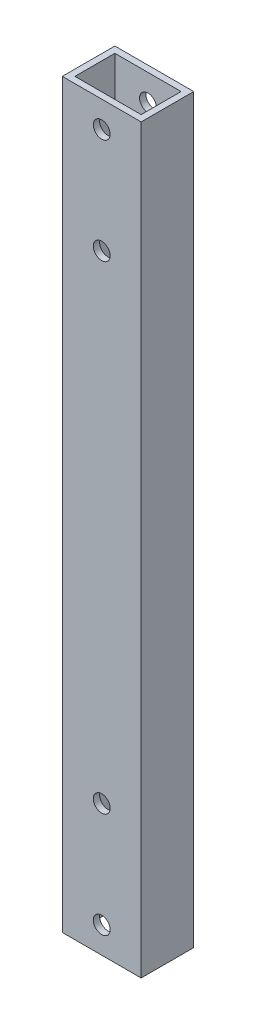
ISO-10303-21;
HEADER;
FILE_DESCRIPTION(('STEP AP214'),'2;1');
FILE_NAME('part.step','',(''),(''),'','','');
FILE_SCHEMA(('AUTOMOTIVE_DESIGN { 1 0 10303 214 1 1 1 1 }'));
ENDSEC;
DATA;
#1=APPLICATION_CONTEXT('core data for automotive mechanical design processes');
#2=APPLICATION_PROTOCOL_DEFINITION('international standard','automotive_design',2000,#1);
#3=PRODUCT_CONTEXT('',#1,'mechanical');
#4=PRODUCT('Part','Part','',(#3));
#5=PRODUCT_RELATED_PRODUCT_CATEGORY('part','',(#4));
#6=PRODUCT_DEFINITION_FORMATION('','',#4);
#7=PRODUCT_DEFINITION_CONTEXT('part definition',#1,'design');
#8=PRODUCT_DEFINITION('design','',#6,#7);
#9=PRODUCT_DEFINITION_SHAPE('','',#8);
#10=(LENGTH_UNIT() NAMED_UNIT(*) SI_UNIT(.MILLI.,.METRE.));
#11=(NAMED_UNIT(*) PLANE_ANGLE_UNIT() SI_UNIT($,.RADIAN.));
#12=(NAMED_UNIT(*) SI_UNIT($,.STERADIAN.) SOLID_ANGLE_UNIT());
#13=UNCERTAINTY_MEASURE_WITH_UNIT(LENGTH_MEASURE(1.E-05),#10,'distance_accuracy_value','');
#14=(GEOMETRIC_REPRESENTATION_CONTEXT(3) GLOBAL_UNCERTAINTY_ASSIGNED_CONTEXT((#13)) GLOBAL_UNIT_ASSIGNED_CONTEXT((#10,
#11,#12)) REPRESENTATION_CONTEXT('',''));
#15=CARTESIAN_POINT('',(0.,0.,0.));
#16=DIRECTION('',(0.,0.,1.));
#17=DIRECTION('',(1.,0.,0.));
#18=AXIS2_PLACEMENT_3D('',#15,#16,#17);
#19=CARTESIAN_POINT('',(0.,70.5,0.));
#20=DIRECTION('',(0.,1.,0.));
#21=DIRECTION('',(0.,0.,1.));
#22=AXIS2_PLACEMENT_3D('',#19,#20,#21);
#23=PLANE('',#22);
#24=DIRECTION('',(0.,0.,-1.));
#25=VECTOR('',#24,1.);
#26=CARTESIAN_POINT('',(7.5,70.5,-5.));
#27=LINE('',#26,#25);
#28=CARTESIAN_POINT('',(7.5,70.5,5.));
#29=VERTEX_POINT('',#28);
#30=CARTESIAN_POINT('',(7.5,70.5,-5.));
#31=VERTEX_POINT('',#30);
#32=EDGE_CURVE('E137',#29,#31,#27,.T.);
#33=ORIENTED_EDGE('',*,*,#32,.T.);
#34=DIRECTION('',(-1.,0.,0.));
#35=VECTOR('',#34,1.);
#36=CARTESIAN_POINT('',(-7.5,70.5,-5.));
#37=LINE('',#36,#35);
#38=CARTESIAN_POINT('',(-7.5,70.5,-5.));
#39=VERTEX_POINT('',#38);
#40=EDGE_CURVE('E140',#31,#39,#37,.T.);
#41=ORIENTED_EDGE('',*,*,#40,.T.);
#42=DIRECTION('',(0.,0.,1.));
#43=VECTOR('',#42,1.);
#44=CARTESIAN_POINT('',(-7.5,70.5,-5.));
#45=LINE('',#44,#43);
#46=CARTESIAN_POINT('',(-7.5,70.5,5.));
#47=VERTEX_POINT('',#46);
#48=EDGE_CURVE('E143',#39,#47,#45,.T.);
#49=ORIENTED_EDGE('',*,*,#48,.T.);
#50=DIRECTION('',(1.,0.,0.));
#51=VECTOR('',#50,1.);
#52=CARTESIAN_POINT('',(-7.5,70.5,5.));
#53=LINE('',#52,#51);
#54=EDGE_CURVE('E145',#47,#29,#53,.T.);
#55=ORIENTED_EDGE('',*,*,#54,.T.);
#56=EDGE_LOOP('',(#33,#41,#49,#55));
#57=FACE_BOUND('',#56,.T.);
#58=DIRECTION('',(1.,0.,0.));
#59=VECTOR('',#58,1.);
#60=CARTESIAN_POINT('',(-6.3,70.5,3.8));
#61=LINE('',#60,#59);
#62=CARTESIAN_POINT('',(-6.3,70.5,3.8));
#63=VERTEX_POINT('',#62);
#64=CARTESIAN_POINT('',(6.3,70.5,3.8));
#65=VERTEX_POINT('',#64);
#66=EDGE_CURVE('E107',#63,#65,#61,.T.);
#67=ORIENTED_EDGE('',*,*,#66,.F.);
#68=DIRECTION('',(0.,0.,1.));
#69=VECTOR('',#68,1.);
#70=CARTESIAN_POINT('',(-6.3,70.5,-3.8));
#71=LINE('',#70,#69);
#72=CARTESIAN_POINT('',(-6.3,70.5,-3.8));
#73=VERTEX_POINT('',#72);
#74=EDGE_CURVE('E99',#73,#63,#71,.T.);
#75=ORIENTED_EDGE('',*,*,#74,.F.);
#76=DIRECTION('',(-1.,0.,0.));
#77=VECTOR('',#76,1.);
#78=CARTESIAN_POINT('',(-6.3,70.5,-3.8));
#79=LINE('',#78,#77);
#80=CARTESIAN_POINT('',(6.3,70.5,-3.8));
#81=VERTEX_POINT('',#80);
#82=EDGE_CURVE('E121',#81,#73,#79,.T.);
#83=ORIENTED_EDGE('',*,*,#82,.F.);
#84=DIRECTION('',(0.,0.,-1.));
#85=VECTOR('',#84,1.);
#86=CARTESIAN_POINT('',(6.3,70.5,-3.8));
#87=LINE('',#86,#85);
#88=EDGE_CURVE('E119',#65,#81,#87,.T.);
#89=ORIENTED_EDGE('',*,*,#88,.F.);
#90=EDGE_LOOP('',(#67,#75,#83,#89));
#91=FACE_BOUND('',#90,.T.);
#92=ADVANCED_FACE('F32',(#57,#91),#23,.T.);
#93=CARTESIAN_POINT('',(0.,-70.5,0.));
#94=DIRECTION('',(0.,1.,0.));
#95=DIRECTION('',(0.,0.,1.));
#96=AXIS2_PLACEMENT_3D('',#93,#94,#95);
#97=PLANE('',#96);
#98=DIRECTION('',(0.,0.,-1.));
#99=VECTOR('',#98,1.);
#100=CARTESIAN_POINT('',(7.5,-70.5,-5.));
#101=LINE('',#100,#99);
#102=CARTESIAN_POINT('',(7.5,-70.5,5.));
#103=VERTEX_POINT('',#102);
#104=CARTESIAN_POINT('',(7.5,-70.5,-5.));
#105=VERTEX_POINT('',#104);
#106=EDGE_CURVE('E115',#103,#105,#101,.T.);
#107=ORIENTED_EDGE('',*,*,#106,.F.);
#108=DIRECTION('',(1.,0.,0.));
#109=VECTOR('',#108,1.);
#110=CARTESIAN_POINT('',(-7.5,-70.5,5.));
#111=LINE('',#110,#109);
#112=CARTESIAN_POINT('',(-7.5,-70.5,5.));
#113=VERTEX_POINT('',#112);
#114=EDGE_CURVE('E141',#113,#103,#111,.T.);
#115=ORIENTED_EDGE('',*,*,#114,.F.);
#116=DIRECTION('',(0.,0.,1.));
#117=VECTOR('',#116,1.);
#118=CARTESIAN_POINT('',(-7.5,-70.5,-5.));
#119=LINE('',#118,#117);
#120=CARTESIAN_POINT('',(-7.5,-70.5,-5.));
#121=VERTEX_POINT('',#120);
#122=EDGE_CURVE('E152',#121,#113,#119,.T.);
#123=ORIENTED_EDGE('',*,*,#122,.F.);
#124=DIRECTION('',(-1.,0.,0.));
#125=VECTOR('',#124,1.);
#126=CARTESIAN_POINT('',(-7.5,-70.5,-5.));
#127=LINE('',#126,#125);
#128=EDGE_CURVE('E150',#105,#121,#127,.T.);
#129=ORIENTED_EDGE('',*,*,#128,.F.);
#130=EDGE_LOOP('',(#107,#115,#123,#129));
#131=FACE_BOUND('',#130,.T.);
#132=DIRECTION('',(0.,0.,1.));
#133=VECTOR('',#132,1.);
#134=CARTESIAN_POINT('',(-6.3,-70.5,-3.8));
#135=LINE('',#134,#133);
#136=CARTESIAN_POINT('',(-6.3,-70.5,-3.8));
#137=VERTEX_POINT('',#136);
#138=CARTESIAN_POINT('',(-6.3,-70.5,3.8));
#139=VERTEX_POINT('',#138);
#140=EDGE_CURVE('E57',#137,#139,#135,.T.);
#141=ORIENTED_EDGE('',*,*,#140,.T.);
#142=DIRECTION('',(1.,0.,0.));
#143=VECTOR('',#142,1.);
#144=CARTESIAN_POINT('',(-6.3,-70.5,3.8));
#145=LINE('',#144,#143);
#146=CARTESIAN_POINT('',(6.3,-70.5,3.8));
#147=VERTEX_POINT('',#146);
#148=EDGE_CURVE('E114',#139,#147,#145,.T.);
#149=ORIENTED_EDGE('',*,*,#148,.T.);
#150=DIRECTION('',(0.,0.,-1.));
#151=VECTOR('',#150,1.);
#152=CARTESIAN_POINT('',(6.3,-70.5,-3.8));
#153=LINE('',#152,#151);
#154=CARTESIAN_POINT('',(6.3,-70.5,-3.8));
#155=VERTEX_POINT('',#154);
#156=EDGE_CURVE('E129',#147,#155,#153,.T.);
#157=ORIENTED_EDGE('',*,*,#156,.T.);
#158=DIRECTION('',(-1.,0.,0.));
#159=VECTOR('',#158,1.);
#160=CARTESIAN_POINT('',(-6.3,-70.5,-3.8));
#161=LINE('',#160,#159);
#162=EDGE_CURVE('E108',#155,#137,#161,.T.);
#163=ORIENTED_EDGE('',*,*,#162,.T.);
#164=EDGE_LOOP('',(#141,#149,#157,#163));
#165=FACE_BOUND('',#164,.T.);
#166=ADVANCED_FACE('F215',(#131,#165),#97,.F.);
#167=CARTESIAN_POINT('',(7.5,70.5,-5.));
#168=DIRECTION('',(-1.,0.,0.));
#169=DIRECTION('',(0.,0.,1.));
#170=AXIS2_PLACEMENT_3D('',#167,#168,#169);
#171=PLANE('',#170);
#172=ORIENTED_EDGE('',*,*,#106,.T.);
#173=DIRECTION('',(0.,-1.,0.));
#174=VECTOR('',#173,1.);
#175=CARTESIAN_POINT('',(7.5,70.5,-5.));
#176=LINE('',#175,#174);
#177=EDGE_CURVE('E11',#31,#105,#176,.T.);
#178=ORIENTED_EDGE('',*,*,#177,.F.);
#179=ORIENTED_EDGE('',*,*,#32,.F.);
#180=DIRECTION('',(0.,-1.,0.));
#181=VECTOR('',#180,1.);
#182=CARTESIAN_POINT('',(7.5,70.5,5.));
#183=LINE('',#182,#181);
#184=EDGE_CURVE('E147',#29,#103,#183,.T.);
#185=ORIENTED_EDGE('',*,*,#184,.T.);
#186=EDGE_LOOP('',(#172,#178,#179,#185));
#187=FACE_BOUND('',#186,.T.);
#188=ADVANCED_FACE('F34',(#187),#171,.F.);
#189=CARTESIAN_POINT('',(-7.5,70.5,-5.));
#190=DIRECTION('',(0.,0.,1.));
#191=DIRECTION('',(1.,0.,0.));
#192=AXIS2_PLACEMENT_3D('',#189,#190,#191);
#193=PLANE('',#192);
#194=CARTESIAN_POINT('',(0.,-65.5,-5.));
#195=DIRECTION('',(0.,0.,-1.));
#196=DIRECTION('',(-1.,0.,0.));
#197=AXIS2_PLACEMENT_3D('',#194,#195,#196);
#198=CIRCLE('',#197,1.60000000000001);
#199=CARTESIAN_POINT('',(-1.60000000000001,-65.5,-5.));
#200=VERTEX_POINT('',#199);
#201=EDGE_CURVE('E166',#200,#200,#198,.T.);
#202=ORIENTED_EDGE('',*,*,#201,.F.);
#203=EDGE_LOOP('',(#202));
#204=FACE_BOUND('',#203,.T.);
#205=CARTESIAN_POINT('',(0.,-45.5,-5.));
#206=DIRECTION('',(0.,0.,-1.));
#207=DIRECTION('',(-1.,0.,0.));
#208=AXIS2_PLACEMENT_3D('',#205,#206,#207);
#209=CIRCLE('',#208,1.6);
#210=CARTESIAN_POINT('',(-1.6,-45.5,-5.));
#211=VERTEX_POINT('',#210);
#212=EDGE_CURVE('E244',#211,#211,#209,.T.);
#213=ORIENTED_EDGE('',*,*,#212,.F.);
#214=EDGE_LOOP('',(#213));
#215=FACE_BOUND('',#214,.T.);
#216=CARTESIAN_POINT('',(0.,45.5,-5.));
#217=DIRECTION('',(0.,0.,-1.));
#218=DIRECTION('',(1.,0.,0.));
#219=AXIS2_PLACEMENT_3D('',#216,#217,#218);
#220=CIRCLE('',#219,1.6);
#221=CARTESIAN_POINT('',(1.59999999999999,45.5,-5.));
#222=VERTEX_POINT('',#221);
#223=EDGE_CURVE('E248',#222,#222,#220,.T.);
#224=ORIENTED_EDGE('',*,*,#223,.F.);
#225=EDGE_LOOP('',(#224));
#226=FACE_BOUND('',#225,.T.);
#227=CARTESIAN_POINT('',(0.,65.5,-5.));
#228=DIRECTION('',(0.,0.,-1.));
#229=DIRECTION('',(1.,0.,0.));
#230=AXIS2_PLACEMENT_3D('',#227,#228,#229);
#231=CIRCLE('',#230,1.60000000000001);
#232=CARTESIAN_POINT('',(1.6,65.5,-5.));
#233=VERTEX_POINT('',#232);
#234=EDGE_CURVE('E252',#233,#233,#231,.T.);
#235=ORIENTED_EDGE('',*,*,#234,.F.);
#236=EDGE_LOOP('',(#235));
#237=FACE_BOUND('',#236,.T.);
#238=ORIENTED_EDGE('',*,*,#128,.T.);
#239=DIRECTION('',(0.,-1.,0.));
#240=VECTOR('',#239,1.);
#241=CARTESIAN_POINT('',(-7.5,70.5,-5.));
#242=LINE('',#241,#240);
#243=EDGE_CURVE('E41',#39,#121,#242,.T.);
#244=ORIENTED_EDGE('',*,*,#243,.F.);
#245=ORIENTED_EDGE('',*,*,#40,.F.);
#246=ORIENTED_EDGE('',*,*,#177,.T.);
#247=EDGE_LOOP('',(#238,#244,#245,#246));
#248=FACE_BOUND('',#247,.T.);
#249=ADVANCED_FACE('F230',(#204,#215,#226,#237,#248),#193,.F.);
#250=CARTESIAN_POINT('',(-7.5,70.5,-5.));
#251=DIRECTION('',(1.,0.,0.));
#252=DIRECTION('',(0.,0.,-1.));
#253=AXIS2_PLACEMENT_3D('',#250,#251,#252);
#254=PLANE('',#253);
#255=ORIENTED_EDGE('',*,*,#122,.T.);
#256=DIRECTION('',(0.,-1.,0.));
#257=VECTOR('',#256,1.);
#258=CARTESIAN_POINT('',(-7.5,70.5,5.));
#259=LINE('',#258,#257);
#260=EDGE_CURVE('E157',#47,#113,#259,.T.);
#261=ORIENTED_EDGE('',*,*,#260,.F.);
#262=ORIENTED_EDGE('',*,*,#48,.F.);
#263=ORIENTED_EDGE('',*,*,#243,.T.);
#264=EDGE_LOOP('',(#255,#261,#262,#263));
#265=FACE_BOUND('',#264,.T.);
#266=ADVANCED_FACE('F228',(#265),#254,.F.);
#267=CARTESIAN_POINT('',(-7.5,70.5,5.));
#268=DIRECTION('',(0.,0.,-1.));
#269=DIRECTION('',(-1.,0.,0.));
#270=AXIS2_PLACEMENT_3D('',#267,#268,#269);
#271=PLANE('',#270);
#272=CARTESIAN_POINT('',(0.,-65.5,5.));
#273=DIRECTION('',(0.,0.,-1.));
#274=DIRECTION('',(-1.,0.,0.));
#275=AXIS2_PLACEMENT_3D('',#272,#273,#274);
#276=CIRCLE('',#275,1.60000000000001);
#277=CARTESIAN_POINT('',(-1.60000000000001,-65.5,5.));
#278=VERTEX_POINT('',#277);
#279=EDGE_CURVE('E127',#278,#278,#276,.T.);
#280=ORIENTED_EDGE('',*,*,#279,.T.);
#281=EDGE_LOOP('',(#280));
#282=FACE_BOUND('',#281,.T.);
#283=CARTESIAN_POINT('',(0.,-45.5,5.));
#284=DIRECTION('',(0.,0.,-1.));
#285=DIRECTION('',(-1.,0.,0.));
#286=AXIS2_PLACEMENT_3D('',#283,#284,#285);
#287=CIRCLE('',#286,1.6);
#288=CARTESIAN_POINT('',(-1.6,-45.5,5.));
#289=VERTEX_POINT('',#288);
#290=EDGE_CURVE('E178',#289,#289,#287,.T.);
#291=ORIENTED_EDGE('',*,*,#290,.T.);
#292=EDGE_LOOP('',(#291));
#293=FACE_BOUND('',#292,.T.);
#294=CARTESIAN_POINT('',(0.,45.5,5.));
#295=DIRECTION('',(0.,0.,-1.));
#296=DIRECTION('',(-1.,0.,0.));
#297=AXIS2_PLACEMENT_3D('',#294,#295,#296);
#298=CIRCLE('',#297,1.6);
#299=CARTESIAN_POINT('',(-1.6,45.5,5.));
#300=VERTEX_POINT('',#299);
#301=EDGE_CURVE('E174',#300,#300,#298,.T.);
#302=ORIENTED_EDGE('',*,*,#301,.T.);
#303=EDGE_LOOP('',(#302));
#304=FACE_BOUND('',#303,.T.);
#305=CARTESIAN_POINT('',(0.,65.5,5.));
#306=DIRECTION('',(0.,0.,-1.));
#307=DIRECTION('',(-1.,0.,0.));
#308=AXIS2_PLACEMENT_3D('',#305,#306,#307);
#309=CIRCLE('',#308,1.60000000000001);
#310=CARTESIAN_POINT('',(-1.60000000000001,65.5,5.));
#311=VERTEX_POINT('',#310);
#312=EDGE_CURVE('E170',#311,#311,#309,.T.);
#313=ORIENTED_EDGE('',*,*,#312,.T.);
#314=EDGE_LOOP('',(#313));
#315=FACE_BOUND('',#314,.T.);
#316=ORIENTED_EDGE('',*,*,#114,.T.);
#317=ORIENTED_EDGE('',*,*,#184,.F.);
#318=ORIENTED_EDGE('',*,*,#54,.F.);
#319=ORIENTED_EDGE('',*,*,#260,.T.);
#320=EDGE_LOOP('',(#316,#317,#318,#319));
#321=FACE_BOUND('',#320,.T.);
#322=ADVANCED_FACE('F195',(#282,#293,#304,#315,#321),#271,.F.);
#323=CARTESIAN_POINT('',(-6.3,70.5,-3.8));
#324=DIRECTION('',(1.,0.,0.));
#325=DIRECTION('',(0.,0.,-1.));
#326=AXIS2_PLACEMENT_3D('',#323,#324,#325);
#327=PLANE('',#326);
#328=ORIENTED_EDGE('',*,*,#140,.F.);
#329=DIRECTION('',(0.,-1.,0.));
#330=VECTOR('',#329,1.);
#331=CARTESIAN_POINT('',(-6.3,70.5,-3.8));
#332=LINE('',#331,#330);
#333=EDGE_CURVE('E103',#73,#137,#332,.T.);
#334=ORIENTED_EDGE('',*,*,#333,.F.);
#335=ORIENTED_EDGE('',*,*,#74,.T.);
#336=DIRECTION('',(0.,-1.,0.));
#337=VECTOR('',#336,1.);
#338=CARTESIAN_POINT('',(-6.3,70.5,3.8));
#339=LINE('',#338,#337);
#340=EDGE_CURVE('E102',#63,#139,#339,.T.);
#341=ORIENTED_EDGE('',*,*,#340,.T.);
#342=EDGE_LOOP('',(#328,#334,#335,#341));
#343=FACE_BOUND('',#342,.T.);
#344=ADVANCED_FACE('F101',(#343),#327,.T.);
#345=CARTESIAN_POINT('',(-6.3,70.5,3.8));
#346=DIRECTION('',(0.,0.,-1.));
#347=DIRECTION('',(-1.,0.,0.));
#348=AXIS2_PLACEMENT_3D('',#345,#346,#347);
#349=PLANE('',#348);
#350=CARTESIAN_POINT('',(0.,-65.5,3.8));
#351=DIRECTION('',(0.,0.,-1.));
#352=DIRECTION('',(-1.,0.,0.));
#353=AXIS2_PLACEMENT_3D('',#350,#351,#352);
#354=CIRCLE('',#353,1.60000000000001);
#355=CARTESIAN_POINT('',(-1.60000000000001,-65.5,3.8));
#356=VERTEX_POINT('',#355);
#357=EDGE_CURVE('E190',#356,#356,#354,.T.);
#358=ORIENTED_EDGE('',*,*,#357,.F.);
#359=EDGE_LOOP('',(#358));
#360=FACE_BOUND('',#359,.T.);
#361=CARTESIAN_POINT('',(0.,-45.5,3.8));
#362=DIRECTION('',(0.,0.,-1.));
#363=DIRECTION('',(-1.,0.,0.));
#364=AXIS2_PLACEMENT_3D('',#361,#362,#363);
#365=CIRCLE('',#364,1.6);
#366=CARTESIAN_POINT('',(-1.6,-45.5,3.8));
#367=VERTEX_POINT('',#366);
#368=EDGE_CURVE('E173',#367,#367,#365,.T.);
#369=ORIENTED_EDGE('',*,*,#368,.F.);
#370=EDGE_LOOP('',(#369));
#371=FACE_BOUND('',#370,.T.);
#372=CARTESIAN_POINT('',(0.,45.5,3.8));
#373=DIRECTION('',(0.,0.,-1.));
#374=DIRECTION('',(-1.,0.,0.));
#375=AXIS2_PLACEMENT_3D('',#372,#373,#374);
#376=CIRCLE('',#375,1.6);
#377=CARTESIAN_POINT('',(-1.6,45.5,3.8));
#378=VERTEX_POINT('',#377);
#379=EDGE_CURVE('E169',#378,#378,#376,.T.);
#380=ORIENTED_EDGE('',*,*,#379,.F.);
#381=EDGE_LOOP('',(#380));
#382=FACE_BOUND('',#381,.T.);
#383=CARTESIAN_POINT('',(0.,65.5,3.8));
#384=DIRECTION('',(0.,0.,-1.));
#385=DIRECTION('',(-1.,0.,0.));
#386=AXIS2_PLACEMENT_3D('',#383,#384,#385);
#387=CIRCLE('',#386,1.60000000000001);
#388=CARTESIAN_POINT('',(-1.60000000000001,65.5,3.8));
#389=VERTEX_POINT('',#388);
#390=EDGE_CURVE('E165',#389,#389,#387,.T.);
#391=ORIENTED_EDGE('',*,*,#390,.F.);
#392=EDGE_LOOP('',(#391));
#393=FACE_BOUND('',#392,.T.);
#394=ORIENTED_EDGE('',*,*,#148,.F.);
#395=ORIENTED_EDGE('',*,*,#340,.F.);
#396=ORIENTED_EDGE('',*,*,#66,.T.);
#397=DIRECTION('',(0.,-1.,0.));
#398=VECTOR('',#397,1.);
#399=CARTESIAN_POINT('',(6.3,70.5,3.8));
#400=LINE('',#399,#398);
#401=EDGE_CURVE('E116',#65,#147,#400,.T.);
#402=ORIENTED_EDGE('',*,*,#401,.T.);
#403=EDGE_LOOP('',(#394,#395,#396,#402));
#404=FACE_BOUND('',#403,.T.);
#405=ADVANCED_FACE('F111',(#360,#371,#382,#393,#404),#349,.T.);
#406=CARTESIAN_POINT('',(6.3,70.5,-3.8));
#407=DIRECTION('',(-1.,0.,0.));
#408=DIRECTION('',(0.,0.,1.));
#409=AXIS2_PLACEMENT_3D('',#406,#407,#408);
#410=PLANE('',#409);
#411=ORIENTED_EDGE('',*,*,#156,.F.);
#412=ORIENTED_EDGE('',*,*,#401,.F.);
#413=ORIENTED_EDGE('',*,*,#88,.T.);
#414=DIRECTION('',(0.,-1.,0.));
#415=VECTOR('',#414,1.);
#416=CARTESIAN_POINT('',(6.3,70.5,-3.8));
#417=LINE('',#416,#415);
#418=EDGE_CURVE('E49',#81,#155,#417,.T.);
#419=ORIENTED_EDGE('',*,*,#418,.T.);
#420=EDGE_LOOP('',(#411,#412,#413,#419));
#421=FACE_BOUND('',#420,.T.);
#422=ADVANCED_FACE('F269',(#421),#410,.T.);
#423=CARTESIAN_POINT('',(-6.3,70.5,-3.8));
#424=DIRECTION('',(0.,0.,1.));
#425=DIRECTION('',(1.,0.,0.));
#426=AXIS2_PLACEMENT_3D('',#423,#424,#425);
#427=PLANE('',#426);
#428=CARTESIAN_POINT('',(0.,-65.5,-3.8));
#429=DIRECTION('',(0.,0.,1.));
#430=DIRECTION('',(1.,0.,0.));
#431=AXIS2_PLACEMENT_3D('',#428,#429,#430);
#432=CIRCLE('',#431,1.60000000000001);
#433=CARTESIAN_POINT('',(1.6,-65.5,-3.8));
#434=VERTEX_POINT('',#433);
#435=EDGE_CURVE('E36',#434,#434,#432,.T.);
#436=ORIENTED_EDGE('',*,*,#435,.F.);
#437=EDGE_LOOP('',(#436));
#438=FACE_BOUND('',#437,.T.);
#439=CARTESIAN_POINT('',(0.,-45.5,-3.8));
#440=DIRECTION('',(0.,0.,1.));
#441=DIRECTION('',(1.,0.,0.));
#442=AXIS2_PLACEMENT_3D('',#439,#440,#441);
#443=CIRCLE('',#442,1.6);
#444=CARTESIAN_POINT('',(1.59999999999999,-45.5,-3.8));
#445=VERTEX_POINT('',#444);
#446=EDGE_CURVE('E171',#445,#445,#443,.T.);
#447=ORIENTED_EDGE('',*,*,#446,.F.);
#448=EDGE_LOOP('',(#447));
#449=FACE_BOUND('',#448,.T.);
#450=CARTESIAN_POINT('',(0.,45.5,-3.8));
#451=DIRECTION('',(0.,0.,1.));
#452=DIRECTION('',(1.,0.,0.));
#453=AXIS2_PLACEMENT_3D('',#450,#451,#452);
#454=CIRCLE('',#453,1.6);
#455=CARTESIAN_POINT('',(1.59999999999999,45.5,-3.8));
#456=VERTEX_POINT('',#455);
#457=EDGE_CURVE('E167',#456,#456,#454,.T.);
#458=ORIENTED_EDGE('',*,*,#457,.F.);
#459=EDGE_LOOP('',(#458));
#460=FACE_BOUND('',#459,.T.);
#461=CARTESIAN_POINT('',(0.,65.5,-3.8));
#462=DIRECTION('',(0.,0.,1.));
#463=DIRECTION('',(1.,0.,0.));
#464=AXIS2_PLACEMENT_3D('',#461,#462,#463);
#465=CIRCLE('',#464,1.60000000000001);
#466=CARTESIAN_POINT('',(1.6,65.5,-3.8));
#467=VERTEX_POINT('',#466);
#468=EDGE_CURVE('E162',#467,#467,#465,.T.);
#469=ORIENTED_EDGE('',*,*,#468,.F.);
#470=EDGE_LOOP('',(#469));
#471=FACE_BOUND('',#470,.T.);
#472=ORIENTED_EDGE('',*,*,#162,.F.);
#473=ORIENTED_EDGE('',*,*,#418,.F.);
#474=ORIENTED_EDGE('',*,*,#82,.T.);
#475=ORIENTED_EDGE('',*,*,#333,.T.);
#476=EDGE_LOOP('',(#472,#473,#474,#475));
#477=FACE_BOUND('',#476,.T.);
#478=ADVANCED_FACE('F266',(#438,#449,#460,#471,#477),#427,.T.);
#479=CARTESIAN_POINT('',(0.,65.5,95.));
#480=DIRECTION('',(0.,0.,-1.));
#481=DIRECTION('',(-1.,0.,0.));
#482=AXIS2_PLACEMENT_3D('',#479,#480,#481);
#483=CYLINDRICAL_SURFACE('',#482,1.60000000000001);
#484=ORIENTED_EDGE('',*,*,#468,.T.);
#485=EDGE_LOOP('',(#484));
#486=FACE_BOUND('',#485,.T.);
#487=ORIENTED_EDGE('',*,*,#234,.T.);
#488=EDGE_LOOP('',(#487));
#489=FACE_BOUND('',#488,.T.);
#490=ADVANCED_FACE('F268',(#486,#489),#483,.F.);
#491=CARTESIAN_POINT('',(0.,45.5,95.));
#492=DIRECTION('',(0.,0.,-1.));
#493=DIRECTION('',(-1.,0.,0.));
#494=AXIS2_PLACEMENT_3D('',#491,#492,#493);
#495=CYLINDRICAL_SURFACE('',#494,1.6);
#496=ORIENTED_EDGE('',*,*,#457,.T.);
#497=EDGE_LOOP('',(#496));
#498=FACE_BOUND('',#497,.T.);
#499=ORIENTED_EDGE('',*,*,#223,.T.);
#500=EDGE_LOOP('',(#499));
#501=FACE_BOUND('',#500,.T.);
#502=ADVANCED_FACE('F276',(#498,#501),#495,.F.);
#503=CARTESIAN_POINT('',(0.,-45.5,95.));
#504=DIRECTION('',(0.,0.,-1.));
#505=DIRECTION('',(-1.,0.,0.));
#506=AXIS2_PLACEMENT_3D('',#503,#504,#505);
#507=CYLINDRICAL_SURFACE('',#506,1.6);
#508=ORIENTED_EDGE('',*,*,#446,.T.);
#509=EDGE_LOOP('',(#508));
#510=FACE_BOUND('',#509,.T.);
#511=ORIENTED_EDGE('',*,*,#212,.T.);
#512=EDGE_LOOP('',(#511));
#513=FACE_BOUND('',#512,.T.);
#514=ADVANCED_FACE('F210',(#510,#513),#507,.F.);
#515=CARTESIAN_POINT('',(0.,-65.5,95.));
#516=DIRECTION('',(0.,0.,-1.));
#517=DIRECTION('',(-1.,0.,0.));
#518=AXIS2_PLACEMENT_3D('',#515,#516,#517);
#519=CYLINDRICAL_SURFACE('',#518,1.60000000000001);
#520=ORIENTED_EDGE('',*,*,#435,.T.);
#521=EDGE_LOOP('',(#520));
#522=FACE_BOUND('',#521,.T.);
#523=ORIENTED_EDGE('',*,*,#201,.T.);
#524=EDGE_LOOP('',(#523));
#525=FACE_BOUND('',#524,.T.);
#526=ADVANCED_FACE('F203',(#522,#525),#519,.F.);
#527=ORIENTED_EDGE('',*,*,#390,.T.);
#528=EDGE_LOOP('',(#527));
#529=FACE_BOUND('',#528,.T.);
#530=ORIENTED_EDGE('',*,*,#312,.F.);
#531=EDGE_LOOP('',(#530));
#532=FACE_BOUND('',#531,.T.);
#533=ADVANCED_FACE('F212',(#529,#532),#483,.F.);
#534=ORIENTED_EDGE('',*,*,#379,.T.);
#535=EDGE_LOOP('',(#534));
#536=FACE_BOUND('',#535,.T.);
#537=ORIENTED_EDGE('',*,*,#301,.F.);
#538=EDGE_LOOP('',(#537));
#539=FACE_BOUND('',#538,.T.);
#540=ADVANCED_FACE('F207',(#536,#539),#495,.F.);
#541=ORIENTED_EDGE('',*,*,#368,.T.);
#542=EDGE_LOOP('',(#541));
#543=FACE_BOUND('',#542,.T.);
#544=ORIENTED_EDGE('',*,*,#290,.F.);
#545=EDGE_LOOP('',(#544));
#546=FACE_BOUND('',#545,.T.);
#547=ADVANCED_FACE('F200',(#543,#546),#507,.F.);
#548=ORIENTED_EDGE('',*,*,#357,.T.);
#549=EDGE_LOOP('',(#548));
#550=FACE_BOUND('',#549,.T.);
#551=ORIENTED_EDGE('',*,*,#279,.F.);
#552=EDGE_LOOP('',(#551));
#553=FACE_BOUND('',#552,.T.);
#554=ADVANCED_FACE('F198',(#550,#553),#519,.F.);
#555=CLOSED_SHELL('',(#92,#166,#188,#249,#266,#322,#344,#405,#422,#478,#490,#502,#514,#526,#533,
#540,#547,#554));
#556=MANIFOLD_SOLID_BREP('B2',#555);
#557=ADVANCED_BREP_SHAPE_REPRESENTATION('',(#18,#556),#14);
#558=SHAPE_DEFINITION_REPRESENTATION(#9,#557);
ENDSEC;
END-ISO-10303-21;
